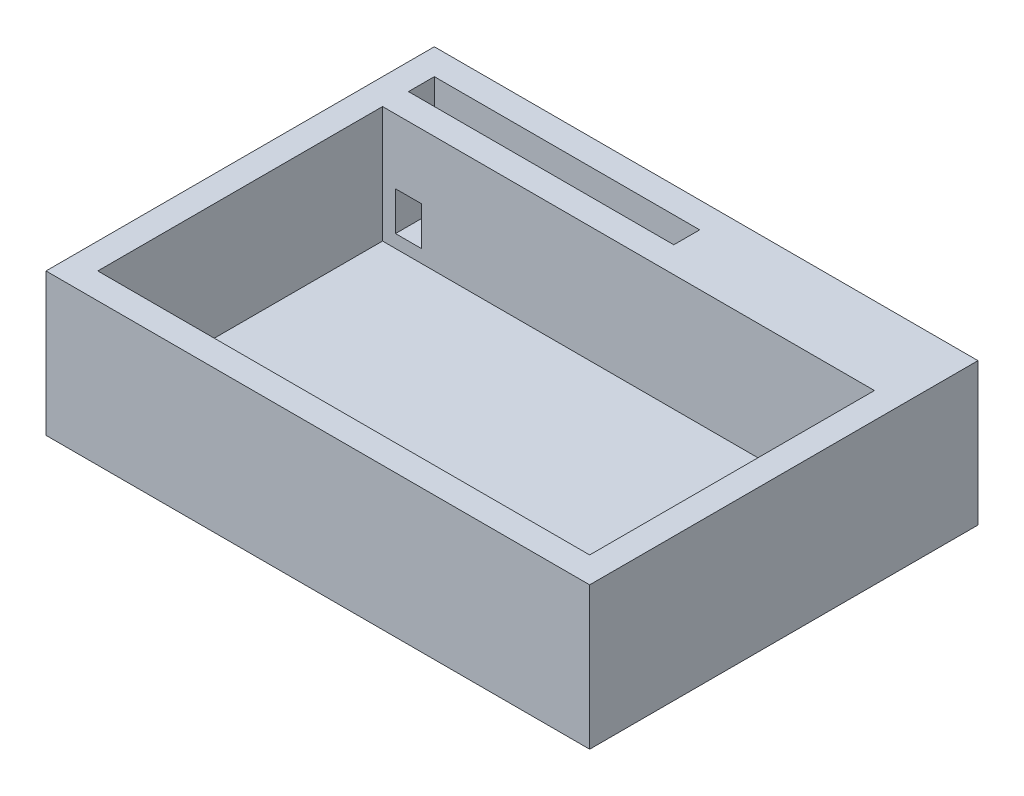
ISO-10303-21;
HEADER;
FILE_DESCRIPTION(('STEP AP214'),'2;1');
FILE_NAME('part.step','',(''),(''),'','','');
FILE_SCHEMA(('AUTOMOTIVE_DESIGN { 1 0 10303 214 1 1 1 1 }'));
ENDSEC;
DATA;
#1=APPLICATION_CONTEXT('core data for automotive mechanical design processes');
#2=APPLICATION_PROTOCOL_DEFINITION('international standard','automotive_design',2000,#1);
#3=PRODUCT_CONTEXT('',#1,'mechanical');
#4=PRODUCT('Part','Part','',(#3));
#5=PRODUCT_RELATED_PRODUCT_CATEGORY('part','',(#4));
#6=PRODUCT_DEFINITION_FORMATION('','',#4);
#7=PRODUCT_DEFINITION_CONTEXT('part definition',#1,'design');
#8=PRODUCT_DEFINITION('design','',#6,#7);
#9=PRODUCT_DEFINITION_SHAPE('','',#8);
#10=(LENGTH_UNIT() NAMED_UNIT(*) SI_UNIT(.MILLI.,.METRE.));
#11=(NAMED_UNIT(*) PLANE_ANGLE_UNIT() SI_UNIT($,.RADIAN.));
#12=(NAMED_UNIT(*) SI_UNIT($,.STERADIAN.) SOLID_ANGLE_UNIT());
#13=UNCERTAINTY_MEASURE_WITH_UNIT(LENGTH_MEASURE(1.E-05),#10,'distance_accuracy_value','');
#14=(GEOMETRIC_REPRESENTATION_CONTEXT(3) GLOBAL_UNCERTAINTY_ASSIGNED_CONTEXT((#13)) GLOBAL_UNIT_ASSIGNED_CONTEXT((#10,
#11,#12)) REPRESENTATION_CONTEXT('',''));
#15=CARTESIAN_POINT('',(0.,0.,0.));
#16=DIRECTION('',(0.,0.,1.));
#17=DIRECTION('',(1.,0.,0.));
#18=AXIS2_PLACEMENT_3D('',#15,#16,#17);
#19=CARTESIAN_POINT('',(0.,2.,0.));
#20=DIRECTION('',(1.,0.,0.));
#21=DIRECTION('',(0.,0.,-1.));
#22=AXIS2_PLACEMENT_3D('',#19,#20,#21);
#23=PLANE('',#22);
#24=DIRECTION('',(0.,0.,1.));
#25=VECTOR('',#24,1.);
#26=CARTESIAN_POINT('',(0.,0.,0.));
#27=LINE('',#26,#25);
#28=CARTESIAN_POINT('',(0.,0.,-30.));
#29=VERTEX_POINT('',#28);
#30=CARTESIAN_POINT('',(0.,0.,0.));
#31=VERTEX_POINT('',#30);
#32=EDGE_CURVE('E306',#29,#31,#27,.T.);
#33=ORIENTED_EDGE('',*,*,#32,.T.);
#34=DIRECTION('',(0.,-1.,0.));
#35=VECTOR('',#34,1.);
#36=CARTESIAN_POINT('',(0.,2.,0.));
#37=LINE('',#36,#35);
#38=CARTESIAN_POINT('',(0.,11.,0.));
#39=VERTEX_POINT('',#38);
#40=EDGE_CURVE('E11',#39,#31,#37,.T.);
#41=ORIENTED_EDGE('',*,*,#40,.F.);
#42=DIRECTION('',(0.,0.,1.));
#43=VECTOR('',#42,1.);
#44=CARTESIAN_POINT('',(0.,11.,-30.));
#45=LINE('',#44,#43);
#46=CARTESIAN_POINT('',(0.,11.,-30.));
#47=VERTEX_POINT('',#46);
#48=EDGE_CURVE('E290',#47,#39,#45,.T.);
#49=ORIENTED_EDGE('',*,*,#48,.F.);
#50=DIRECTION('',(0.,-1.,0.));
#51=VECTOR('',#50,1.);
#52=CARTESIAN_POINT('',(0.,2.,-30.));
#53=LINE('',#52,#51);
#54=EDGE_CURVE('E319',#47,#29,#53,.T.);
#55=ORIENTED_EDGE('',*,*,#54,.T.);
#56=EDGE_LOOP('',(#33,#41,#49,#55));
#57=FACE_BOUND('',#56,.T.);
#58=ADVANCED_FACE('F45',(#57),#23,.F.);
#59=CARTESIAN_POINT('',(0.,2.,0.));
#60=DIRECTION('',(0.,0.,-1.));
#61=DIRECTION('',(-1.,0.,0.));
#62=AXIS2_PLACEMENT_3D('',#59,#60,#61);
#63=PLANE('',#62);
#64=DIRECTION('',(1.,0.,0.));
#65=VECTOR('',#64,1.);
#66=CARTESIAN_POINT('',(0.,0.,0.));
#67=LINE('',#66,#65);
#68=CARTESIAN_POINT('',(42.,0.,0.));
#69=VERTEX_POINT('',#68);
#70=EDGE_CURVE('E310',#31,#69,#67,.T.);
#71=ORIENTED_EDGE('',*,*,#70,.T.);
#72=DIRECTION('',(0.,-1.,0.));
#73=VECTOR('',#72,1.);
#74=CARTESIAN_POINT('',(42.,2.,0.));
#75=LINE('',#74,#73);
#76=CARTESIAN_POINT('',(42.,11.,0.));
#77=VERTEX_POINT('',#76);
#78=EDGE_CURVE('E53',#77,#69,#75,.T.);
#79=ORIENTED_EDGE('',*,*,#78,.F.);
#80=DIRECTION('',(1.,0.,0.));
#81=VECTOR('',#80,1.);
#82=CARTESIAN_POINT('',(0.,11.,0.));
#83=LINE('',#82,#81);
#84=EDGE_CURVE('E294',#39,#77,#83,.T.);
#85=ORIENTED_EDGE('',*,*,#84,.F.);
#86=ORIENTED_EDGE('',*,*,#40,.T.);
#87=EDGE_LOOP('',(#71,#79,#85,#86));
#88=FACE_BOUND('',#87,.T.);
#89=ADVANCED_FACE('F346',(#88),#63,.F.);
#90=CARTESIAN_POINT('',(42.,2.,0.));
#91=DIRECTION('',(-1.,0.,0.));
#92=DIRECTION('',(0.,0.,1.));
#93=AXIS2_PLACEMENT_3D('',#90,#91,#92);
#94=PLANE('',#93);
#95=DIRECTION('',(0.,0.,-1.));
#96=VECTOR('',#95,1.);
#97=CARTESIAN_POINT('',(42.,0.,0.));
#98=LINE('',#97,#96);
#99=CARTESIAN_POINT('',(42.,0.,-30.));
#100=VERTEX_POINT('',#99);
#101=EDGE_CURVE('E313',#69,#100,#98,.T.);
#102=ORIENTED_EDGE('',*,*,#101,.T.);
#103=DIRECTION('',(0.,-1.,0.));
#104=VECTOR('',#103,1.);
#105=CARTESIAN_POINT('',(42.,2.,-30.));
#106=LINE('',#105,#104);
#107=CARTESIAN_POINT('',(42.,11.,-30.));
#108=VERTEX_POINT('',#107);
#109=EDGE_CURVE('E323',#108,#100,#106,.T.);
#110=ORIENTED_EDGE('',*,*,#109,.F.);
#111=DIRECTION('',(0.,0.,-1.));
#112=VECTOR('',#111,1.);
#113=CARTESIAN_POINT('',(42.,11.,-30.));
#114=LINE('',#113,#112);
#115=EDGE_CURVE('E298',#77,#108,#114,.T.);
#116=ORIENTED_EDGE('',*,*,#115,.F.);
#117=ORIENTED_EDGE('',*,*,#78,.T.);
#118=EDGE_LOOP('',(#102,#110,#116,#117));
#119=FACE_BOUND('',#118,.T.);
#120=ADVANCED_FACE('F331',(#119),#94,.F.);
#121=CARTESIAN_POINT('',(0.,2.,-30.));
#122=DIRECTION('',(0.,0.,1.));
#123=DIRECTION('',(1.,0.,0.));
#124=AXIS2_PLACEMENT_3D('',#121,#122,#123);
#125=PLANE('',#124);
#126=DIRECTION('',(-1.,0.,0.));
#127=VECTOR('',#126,1.);
#128=CARTESIAN_POINT('',(0.,0.,-30.));
#129=LINE('',#128,#127);
#130=EDGE_CURVE('E316',#100,#29,#129,.T.);
#131=ORIENTED_EDGE('',*,*,#130,.T.);
#132=ORIENTED_EDGE('',*,*,#54,.F.);
#133=DIRECTION('',(-1.,0.,0.));
#134=VECTOR('',#133,1.);
#135=CARTESIAN_POINT('',(0.,11.,-30.));
#136=LINE('',#135,#134);
#137=EDGE_CURVE('E302',#108,#47,#136,.T.);
#138=ORIENTED_EDGE('',*,*,#137,.F.);
#139=ORIENTED_EDGE('',*,*,#109,.T.);
#140=EDGE_LOOP('',(#131,#132,#138,#139));
#141=FACE_BOUND('',#140,.T.);
#142=ADVANCED_FACE('F339',(#141),#125,.F.);
#143=CARTESIAN_POINT('',(0.,0.,0.));
#144=DIRECTION('',(0.,-1.,0.));
#145=DIRECTION('',(0.,0.,-1.));
#146=AXIS2_PLACEMENT_3D('',#143,#144,#145);
#147=PLANE('',#146);
#148=ORIENTED_EDGE('',*,*,#32,.F.);
#149=ORIENTED_EDGE('',*,*,#130,.F.);
#150=ORIENTED_EDGE('',*,*,#101,.F.);
#151=ORIENTED_EDGE('',*,*,#70,.F.);
#152=EDGE_LOOP('',(#148,#149,#150,#151));
#153=FACE_BOUND('',#152,.T.);
#154=ADVANCED_FACE('F337',(#153),#147,.T.);
#155=CARTESIAN_POINT('',(0.,11.,0.));
#156=DIRECTION('',(0.,1.,0.));
#157=DIRECTION('',(0.,0.,1.));
#158=AXIS2_PLACEMENT_3D('',#155,#156,#157);
#159=PLANE('',#158);
#160=ORIENTED_EDGE('',*,*,#48,.T.);
#161=ORIENTED_EDGE('',*,*,#84,.T.);
#162=ORIENTED_EDGE('',*,*,#115,.T.);
#163=ORIENTED_EDGE('',*,*,#137,.T.);
#164=EDGE_LOOP('',(#160,#161,#162,#163));
#165=FACE_BOUND('',#164,.T.);
#166=DIRECTION('',(1.,0.,0.));
#167=VECTOR('',#166,1.);
#168=CARTESIAN_POINT('',(2.,11.,-26.));
#169=LINE('',#168,#167);
#170=CARTESIAN_POINT('',(2.,11.,-26.));
#171=VERTEX_POINT('',#170);
#172=CARTESIAN_POINT('',(22.5,11.,-26.));
#173=VERTEX_POINT('',#172);
#174=EDGE_CURVE('E252',#171,#173,#169,.T.);
#175=ORIENTED_EDGE('',*,*,#174,.F.);
#176=DIRECTION('',(0.,0.,1.));
#177=VECTOR('',#176,1.);
#178=CARTESIAN_POINT('',(2.,11.,-28.));
#179=LINE('',#178,#177);
#180=CARTESIAN_POINT('',(2.,11.,-28.));
#181=VERTEX_POINT('',#180);
#182=EDGE_CURVE('E249',#181,#171,#179,.T.);
#183=ORIENTED_EDGE('',*,*,#182,.F.);
#184=DIRECTION('',(-1.,0.,0.));
#185=VECTOR('',#184,1.);
#186=CARTESIAN_POINT('',(2.,11.,-28.));
#187=LINE('',#186,#185);
#188=CARTESIAN_POINT('',(22.5,11.,-28.));
#189=VERTEX_POINT('',#188);
#190=EDGE_CURVE('E260',#189,#181,#187,.T.);
#191=ORIENTED_EDGE('',*,*,#190,.F.);
#192=DIRECTION('',(0.,0.,-1.));
#193=VECTOR('',#192,1.);
#194=CARTESIAN_POINT('',(22.5,11.,-26.));
#195=LINE('',#194,#193);
#196=EDGE_CURVE('E256',#173,#189,#195,.T.);
#197=ORIENTED_EDGE('',*,*,#196,.F.);
#198=EDGE_LOOP('',(#175,#183,#191,#197));
#199=FACE_BOUND('',#198,.T.);
#200=DIRECTION('',(-1.,0.,0.));
#201=VECTOR('',#200,1.);
#202=CARTESIAN_POINT('',(2.,11.,-24.));
#203=LINE('',#202,#201);
#204=CARTESIAN_POINT('',(40.,11.,-24.));
#205=VERTEX_POINT('',#204);
#206=CARTESIAN_POINT('',(2.,11.,-24.));
#207=VERTEX_POINT('',#206);
#208=EDGE_CURVE('E210',#205,#207,#203,.T.);
#209=ORIENTED_EDGE('',*,*,#208,.F.);
#210=DIRECTION('',(0.,0.,-1.));
#211=VECTOR('',#210,1.);
#212=CARTESIAN_POINT('',(40.,11.,-24.));
#213=LINE('',#212,#211);
#214=CARTESIAN_POINT('',(40.,11.,-2.));
#215=VERTEX_POINT('',#214);
#216=EDGE_CURVE('E207',#215,#205,#213,.T.);
#217=ORIENTED_EDGE('',*,*,#216,.F.);
#218=DIRECTION('',(1.,0.,0.));
#219=VECTOR('',#218,1.);
#220=CARTESIAN_POINT('',(2.,11.,-2.));
#221=LINE('',#220,#219);
#222=CARTESIAN_POINT('',(2.,11.,-2.));
#223=VERTEX_POINT('',#222);
#224=EDGE_CURVE('E218',#223,#215,#221,.T.);
#225=ORIENTED_EDGE('',*,*,#224,.F.);
#226=DIRECTION('',(0.,0.,1.));
#227=VECTOR('',#226,1.);
#228=CARTESIAN_POINT('',(2.,11.,-24.));
#229=LINE('',#228,#227);
#230=EDGE_CURVE('E214',#207,#223,#229,.T.);
#231=ORIENTED_EDGE('',*,*,#230,.F.);
#232=EDGE_LOOP('',(#209,#217,#225,#231));
#233=FACE_BOUND('',#232,.T.);
#234=ADVANCED_FACE('F344',(#165,#199,#233),#159,.T.);
#235=CARTESIAN_POINT('',(2.,11.,-28.));
#236=DIRECTION('',(1.,0.,0.));
#237=DIRECTION('',(0.,0.,-1.));
#238=AXIS2_PLACEMENT_3D('',#235,#236,#237);
#239=PLANE('',#238);
#240=DIRECTION('',(0.,0.,1.));
#241=VECTOR('',#240,1.);
#242=CARTESIAN_POINT('',(2.,2.,-28.));
#243=LINE('',#242,#241);
#244=CARTESIAN_POINT('',(2.,2.,-28.));
#245=VERTEX_POINT('',#244);
#246=CARTESIAN_POINT('',(2.,2.,-26.));
#247=VERTEX_POINT('',#246);
#248=EDGE_CURVE('E248',#245,#247,#243,.T.);
#249=ORIENTED_EDGE('',*,*,#248,.F.);
#250=DIRECTION('',(0.,-1.,0.));
#251=VECTOR('',#250,1.);
#252=CARTESIAN_POINT('',(2.,11.,-28.));
#253=LINE('',#252,#251);
#254=EDGE_CURVE('E263',#181,#245,#253,.T.);
#255=ORIENTED_EDGE('',*,*,#254,.F.);
#256=ORIENTED_EDGE('',*,*,#182,.T.);
#257=DIRECTION('',(0.,-1.,0.));
#258=VECTOR('',#257,1.);
#259=CARTESIAN_POINT('',(2.,11.,-26.));
#260=LINE('',#259,#258);
#261=EDGE_CURVE('E286',#171,#247,#260,.T.);
#262=ORIENTED_EDGE('',*,*,#261,.T.);
#263=EDGE_LOOP('',(#249,#255,#256,#262));
#264=FACE_BOUND('',#263,.T.);
#265=ADVANCED_FACE('F365',(#264),#239,.T.);
#266=CARTESIAN_POINT('',(2.,11.,-26.));
#267=DIRECTION('',(0.,0.,-1.));
#268=DIRECTION('',(-1.,0.,0.));
#269=AXIS2_PLACEMENT_3D('',#266,#267,#268);
#270=PLANE('',#269);
#271=DIRECTION('',(0.,-1.,0.));
#272=VECTOR('',#271,1.);
#273=CARTESIAN_POINT('',(3.,3.,-26.));
#274=LINE('',#273,#272);
#275=CARTESIAN_POINT('',(3.,6.,-26.));
#276=VERTEX_POINT('',#275);
#277=CARTESIAN_POINT('',(3.,3.,-26.));
#278=VERTEX_POINT('',#277);
#279=EDGE_CURVE('E160',#276,#278,#274,.T.);
#280=ORIENTED_EDGE('',*,*,#279,.T.);
#281=DIRECTION('',(1.,0.,0.));
#282=VECTOR('',#281,1.);
#283=CARTESIAN_POINT('',(3.,3.,-26.));
#284=LINE('',#283,#282);
#285=CARTESIAN_POINT('',(5.,3.,-26.));
#286=VERTEX_POINT('',#285);
#287=EDGE_CURVE('E170',#278,#286,#284,.T.);
#288=ORIENTED_EDGE('',*,*,#287,.T.);
#289=DIRECTION('',(0.,1.,0.));
#290=VECTOR('',#289,1.);
#291=CARTESIAN_POINT('',(5.,3.,-26.));
#292=LINE('',#291,#290);
#293=CARTESIAN_POINT('',(5.,6.,-26.));
#294=VERTEX_POINT('',#293);
#295=EDGE_CURVE('E60',#286,#294,#292,.T.);
#296=ORIENTED_EDGE('',*,*,#295,.T.);
#297=DIRECTION('',(-1.,0.,0.));
#298=VECTOR('',#297,1.);
#299=CARTESIAN_POINT('',(3.,6.,-26.));
#300=LINE('',#299,#298);
#301=EDGE_CURVE('E167',#294,#276,#300,.T.);
#302=ORIENTED_EDGE('',*,*,#301,.T.);
#303=EDGE_LOOP('',(#280,#288,#296,#302));
#304=FACE_BOUND('',#303,.T.);
#305=DIRECTION('',(1.,0.,0.));
#306=VECTOR('',#305,1.);
#307=CARTESIAN_POINT('',(2.,2.,-26.));
#308=LINE('',#307,#306);
#309=CARTESIAN_POINT('',(22.5,2.,-26.));
#310=VERTEX_POINT('',#309);
#311=EDGE_CURVE('E267',#247,#310,#308,.T.);
#312=ORIENTED_EDGE('',*,*,#311,.F.);
#313=ORIENTED_EDGE('',*,*,#261,.F.);
#314=ORIENTED_EDGE('',*,*,#174,.T.);
#315=DIRECTION('',(0.,-1.,0.));
#316=VECTOR('',#315,1.);
#317=CARTESIAN_POINT('',(22.5,11.,-26.));
#318=LINE('',#317,#316);
#319=EDGE_CURVE('E283',#173,#310,#318,.T.);
#320=ORIENTED_EDGE('',*,*,#319,.T.);
#321=EDGE_LOOP('',(#312,#313,#314,#320));
#322=FACE_BOUND('',#321,.T.);
#323=ADVANCED_FACE('F175',(#304,#322),#270,.T.);
#324=CARTESIAN_POINT('',(22.5,11.,-26.));
#325=DIRECTION('',(-1.,0.,0.));
#326=DIRECTION('',(0.,0.,1.));
#327=AXIS2_PLACEMENT_3D('',#324,#325,#326);
#328=PLANE('',#327);
#329=DIRECTION('',(0.,0.,-1.));
#330=VECTOR('',#329,1.);
#331=CARTESIAN_POINT('',(22.5,2.,-26.));
#332=LINE('',#331,#330);
#333=CARTESIAN_POINT('',(22.5,2.,-28.));
#334=VERTEX_POINT('',#333);
#335=EDGE_CURVE('E271',#310,#334,#332,.T.);
#336=ORIENTED_EDGE('',*,*,#335,.F.);
#337=ORIENTED_EDGE('',*,*,#319,.F.);
#338=ORIENTED_EDGE('',*,*,#196,.T.);
#339=DIRECTION('',(0.,-1.,0.));
#340=VECTOR('',#339,1.);
#341=CARTESIAN_POINT('',(22.5,11.,-28.));
#342=LINE('',#341,#340);
#343=EDGE_CURVE('E280',#189,#334,#342,.T.);
#344=ORIENTED_EDGE('',*,*,#343,.T.);
#345=EDGE_LOOP('',(#336,#337,#338,#344));
#346=FACE_BOUND('',#345,.T.);
#347=ADVANCED_FACE('F371',(#346),#328,.T.);
#348=CARTESIAN_POINT('',(2.,11.,-28.));
#349=DIRECTION('',(0.,0.,1.));
#350=DIRECTION('',(1.,0.,0.));
#351=AXIS2_PLACEMENT_3D('',#348,#349,#350);
#352=PLANE('',#351);
#353=DIRECTION('',(-1.,0.,0.));
#354=VECTOR('',#353,1.);
#355=CARTESIAN_POINT('',(2.,2.,-28.));
#356=LINE('',#355,#354);
#357=EDGE_CURVE('E253',#334,#245,#356,.T.);
#358=ORIENTED_EDGE('',*,*,#357,.F.);
#359=ORIENTED_EDGE('',*,*,#343,.F.);
#360=ORIENTED_EDGE('',*,*,#190,.T.);
#361=ORIENTED_EDGE('',*,*,#254,.T.);
#362=EDGE_LOOP('',(#358,#359,#360,#361));
#363=FACE_BOUND('',#362,.T.);
#364=ADVANCED_FACE('F374',(#363),#352,.T.);
#365=CARTESIAN_POINT('',(40.,11.,-24.));
#366=DIRECTION('',(-1.,0.,0.));
#367=DIRECTION('',(0.,0.,1.));
#368=AXIS2_PLACEMENT_3D('',#365,#366,#367);
#369=PLANE('',#368);
#370=DIRECTION('',(0.,0.,-1.));
#371=VECTOR('',#370,1.);
#372=CARTESIAN_POINT('',(40.,2.,-24.));
#373=LINE('',#372,#371);
#374=CARTESIAN_POINT('',(40.,2.,-2.));
#375=VERTEX_POINT('',#374);
#376=CARTESIAN_POINT('',(40.,2.,-24.));
#377=VERTEX_POINT('',#376);
#378=EDGE_CURVE('E201',#375,#377,#373,.T.);
#379=ORIENTED_EDGE('',*,*,#378,.F.);
#380=DIRECTION('',(0.,-1.,0.));
#381=VECTOR('',#380,1.);
#382=CARTESIAN_POINT('',(40.,11.,-2.));
#383=LINE('',#382,#381);
#384=EDGE_CURVE('E221',#215,#375,#383,.T.);
#385=ORIENTED_EDGE('',*,*,#384,.F.);
#386=ORIENTED_EDGE('',*,*,#216,.T.);
#387=DIRECTION('',(0.,-1.,0.));
#388=VECTOR('',#387,1.);
#389=CARTESIAN_POINT('',(40.,11.,-24.));
#390=LINE('',#389,#388);
#391=EDGE_CURVE('E244',#205,#377,#390,.T.);
#392=ORIENTED_EDGE('',*,*,#391,.T.);
#393=EDGE_LOOP('',(#379,#385,#386,#392));
#394=FACE_BOUND('',#393,.T.);
#395=ADVANCED_FACE('F378',(#394),#369,.T.);
#396=CARTESIAN_POINT('',(2.,11.,-24.));
#397=DIRECTION('',(0.,0.,1.));
#398=DIRECTION('',(1.,0.,0.));
#399=AXIS2_PLACEMENT_3D('',#396,#397,#398);
#400=PLANE('',#399);
#401=DIRECTION('',(0.,-1.,0.));
#402=VECTOR('',#401,1.);
#403=CARTESIAN_POINT('',(3.,3.,-24.));
#404=LINE('',#403,#402);
#405=CARTESIAN_POINT('',(3.,6.,-24.));
#406=VERTEX_POINT('',#405);
#407=CARTESIAN_POINT('',(3.,3.,-24.));
#408=VERTEX_POINT('',#407);
#409=EDGE_CURVE('E68',#406,#408,#404,.T.);
#410=ORIENTED_EDGE('',*,*,#409,.F.);
#411=DIRECTION('',(-1.,0.,0.));
#412=VECTOR('',#411,1.);
#413=CARTESIAN_POINT('',(3.,6.,-24.));
#414=LINE('',#413,#412);
#415=CARTESIAN_POINT('',(5.,6.,-24.));
#416=VERTEX_POINT('',#415);
#417=EDGE_CURVE('E179',#416,#406,#414,.T.);
#418=ORIENTED_EDGE('',*,*,#417,.F.);
#419=DIRECTION('',(0.,1.,0.));
#420=VECTOR('',#419,1.);
#421=CARTESIAN_POINT('',(5.,3.,-24.));
#422=LINE('',#421,#420);
#423=CARTESIAN_POINT('',(5.,3.,-24.));
#424=VERTEX_POINT('',#423);
#425=EDGE_CURVE('E183',#424,#416,#422,.T.);
#426=ORIENTED_EDGE('',*,*,#425,.F.);
#427=DIRECTION('',(1.,0.,0.));
#428=VECTOR('',#427,1.);
#429=CARTESIAN_POINT('',(3.,3.,-24.));
#430=LINE('',#429,#428);
#431=EDGE_CURVE('E192',#408,#424,#430,.T.);
#432=ORIENTED_EDGE('',*,*,#431,.F.);
#433=EDGE_LOOP('',(#410,#418,#426,#432));
#434=FACE_BOUND('',#433,.T.);
#435=DIRECTION('',(-1.,0.,0.));
#436=VECTOR('',#435,1.);
#437=CARTESIAN_POINT('',(2.,2.,-24.));
#438=LINE('',#437,#436);
#439=CARTESIAN_POINT('',(2.,2.,-24.));
#440=VERTEX_POINT('',#439);
#441=EDGE_CURVE('E225',#377,#440,#438,.T.);
#442=ORIENTED_EDGE('',*,*,#441,.F.);
#443=ORIENTED_EDGE('',*,*,#391,.F.);
#444=ORIENTED_EDGE('',*,*,#208,.T.);
#445=DIRECTION('',(0.,-1.,0.));
#446=VECTOR('',#445,1.);
#447=CARTESIAN_POINT('',(2.,11.,-24.));
#448=LINE('',#447,#446);
#449=EDGE_CURVE('E241',#207,#440,#448,.T.);
#450=ORIENTED_EDGE('',*,*,#449,.T.);
#451=EDGE_LOOP('',(#442,#443,#444,#450));
#452=FACE_BOUND('',#451,.T.);
#453=ADVANCED_FACE('F382',(#434,#452),#400,.T.);
#454=CARTESIAN_POINT('',(2.,11.,-24.));
#455=DIRECTION('',(1.,0.,0.));
#456=DIRECTION('',(0.,0.,-1.));
#457=AXIS2_PLACEMENT_3D('',#454,#455,#456);
#458=PLANE('',#457);
#459=DIRECTION('',(0.,0.,1.));
#460=VECTOR('',#459,1.);
#461=CARTESIAN_POINT('',(2.,2.,-24.));
#462=LINE('',#461,#460);
#463=CARTESIAN_POINT('',(2.,2.,-2.));
#464=VERTEX_POINT('',#463);
#465=EDGE_CURVE('E229',#440,#464,#462,.T.);
#466=ORIENTED_EDGE('',*,*,#465,.F.);
#467=ORIENTED_EDGE('',*,*,#449,.F.);
#468=ORIENTED_EDGE('',*,*,#230,.T.);
#469=DIRECTION('',(0.,-1.,0.));
#470=VECTOR('',#469,1.);
#471=CARTESIAN_POINT('',(2.,11.,-2.));
#472=LINE('',#471,#470);
#473=EDGE_CURVE('E238',#223,#464,#472,.T.);
#474=ORIENTED_EDGE('',*,*,#473,.T.);
#475=EDGE_LOOP('',(#466,#467,#468,#474));
#476=FACE_BOUND('',#475,.T.);
#477=ADVANCED_FACE('F386',(#476),#458,.T.);
#478=CARTESIAN_POINT('',(2.,11.,-2.));
#479=DIRECTION('',(0.,0.,-1.));
#480=DIRECTION('',(-1.,0.,0.));
#481=AXIS2_PLACEMENT_3D('',#478,#479,#480);
#482=PLANE('',#481);
#483=DIRECTION('',(1.,0.,0.));
#484=VECTOR('',#483,1.);
#485=CARTESIAN_POINT('',(2.,2.,-2.));
#486=LINE('',#485,#484);
#487=EDGE_CURVE('E211',#464,#375,#486,.T.);
#488=ORIENTED_EDGE('',*,*,#487,.F.);
#489=ORIENTED_EDGE('',*,*,#473,.F.);
#490=ORIENTED_EDGE('',*,*,#224,.T.);
#491=ORIENTED_EDGE('',*,*,#384,.T.);
#492=EDGE_LOOP('',(#488,#489,#490,#491));
#493=FACE_BOUND('',#492,.T.);
#494=ADVANCED_FACE('F390',(#493),#482,.T.);
#495=CARTESIAN_POINT('',(0.,2.,0.));
#496=DIRECTION('',(0.,-1.,0.));
#497=DIRECTION('',(0.,0.,-1.));
#498=AXIS2_PLACEMENT_3D('',#495,#496,#497);
#499=PLANE('',#498);
#500=ORIENTED_EDGE('',*,*,#357,.T.);
#501=ORIENTED_EDGE('',*,*,#248,.T.);
#502=ORIENTED_EDGE('',*,*,#311,.T.);
#503=ORIENTED_EDGE('',*,*,#335,.T.);
#504=EDGE_LOOP('',(#500,#501,#502,#503));
#505=FACE_BOUND('',#504,.T.);
#506=ADVANCED_FACE('F361',(#505),#499,.F.);
#507=ORIENTED_EDGE('',*,*,#487,.T.);
#508=ORIENTED_EDGE('',*,*,#378,.T.);
#509=ORIENTED_EDGE('',*,*,#441,.T.);
#510=ORIENTED_EDGE('',*,*,#465,.T.);
#511=EDGE_LOOP('',(#507,#508,#509,#510));
#512=FACE_BOUND('',#511,.T.);
#513=ADVANCED_FACE('F358',(#512),#499,.F.);
#514=CARTESIAN_POINT('',(3.,3.,-26.));
#515=DIRECTION('',(-1.,0.,0.));
#516=DIRECTION('',(0.,0.,1.));
#517=AXIS2_PLACEMENT_3D('',#514,#515,#516);
#518=PLANE('',#517);
#519=ORIENTED_EDGE('',*,*,#409,.T.);
#520=DIRECTION('',(0.,0.,1.));
#521=VECTOR('',#520,1.);
#522=CARTESIAN_POINT('',(3.,3.,-26.));
#523=LINE('',#522,#521);
#524=EDGE_CURVE('E156',#278,#408,#523,.T.);
#525=ORIENTED_EDGE('',*,*,#524,.F.);
#526=ORIENTED_EDGE('',*,*,#279,.F.);
#527=DIRECTION('',(0.,0.,1.));
#528=VECTOR('',#527,1.);
#529=CARTESIAN_POINT('',(3.,6.,-26.));
#530=LINE('',#529,#528);
#531=EDGE_CURVE('E198',#276,#406,#530,.T.);
#532=ORIENTED_EDGE('',*,*,#531,.T.);
#533=EDGE_LOOP('',(#519,#525,#526,#532));
#534=FACE_BOUND('',#533,.T.);
#535=ADVANCED_FACE('F158',(#534),#518,.F.);
#536=CARTESIAN_POINT('',(3.,6.,-26.));
#537=DIRECTION('',(0.,1.,0.));
#538=DIRECTION('',(0.,0.,1.));
#539=AXIS2_PLACEMENT_3D('',#536,#537,#538);
#540=PLANE('',#539);
#541=ORIENTED_EDGE('',*,*,#417,.T.);
#542=ORIENTED_EDGE('',*,*,#531,.F.);
#543=ORIENTED_EDGE('',*,*,#301,.F.);
#544=DIRECTION('',(0.,0.,1.));
#545=VECTOR('',#544,1.);
#546=CARTESIAN_POINT('',(5.,6.,-26.));
#547=LINE('',#546,#545);
#548=EDGE_CURVE('E202',#294,#416,#547,.T.);
#549=ORIENTED_EDGE('',*,*,#548,.T.);
#550=EDGE_LOOP('',(#541,#542,#543,#549));
#551=FACE_BOUND('',#550,.T.);
#552=ADVANCED_FACE('F397',(#551),#540,.F.);
#553=CARTESIAN_POINT('',(5.,3.,-26.));
#554=DIRECTION('',(1.,0.,0.));
#555=DIRECTION('',(0.,0.,-1.));
#556=AXIS2_PLACEMENT_3D('',#553,#554,#555);
#557=PLANE('',#556);
#558=ORIENTED_EDGE('',*,*,#425,.T.);
#559=ORIENTED_EDGE('',*,*,#548,.F.);
#560=ORIENTED_EDGE('',*,*,#295,.F.);
#561=DIRECTION('',(0.,0.,1.));
#562=VECTOR('',#561,1.);
#563=CARTESIAN_POINT('',(5.,3.,-26.));
#564=LINE('',#563,#562);
#565=EDGE_CURVE('E166',#286,#424,#564,.T.);
#566=ORIENTED_EDGE('',*,*,#565,.T.);
#567=EDGE_LOOP('',(#558,#559,#560,#566));
#568=FACE_BOUND('',#567,.T.);
#569=ADVANCED_FACE('F400',(#568),#557,.F.);
#570=CARTESIAN_POINT('',(3.,3.,-26.));
#571=DIRECTION('',(0.,-1.,0.));
#572=DIRECTION('',(0.,0.,-1.));
#573=AXIS2_PLACEMENT_3D('',#570,#571,#572);
#574=PLANE('',#573);
#575=ORIENTED_EDGE('',*,*,#431,.T.);
#576=ORIENTED_EDGE('',*,*,#565,.F.);
#577=ORIENTED_EDGE('',*,*,#287,.F.);
#578=ORIENTED_EDGE('',*,*,#524,.T.);
#579=EDGE_LOOP('',(#575,#576,#577,#578));
#580=FACE_BOUND('',#579,.T.);
#581=ADVANCED_FACE('F171',(#580),#574,.F.);
#582=CLOSED_SHELL('',(#58,#89,#120,#142,#154,#234,#265,#323,#347,#364,#395,#453,#477,#494,#506,
#513,#535,#552,#569,#581));
#583=MANIFOLD_SOLID_BREP('B2',#582);
#584=ADVANCED_BREP_SHAPE_REPRESENTATION('',(#18,#583),#14);
#585=SHAPE_DEFINITION_REPRESENTATION(#9,#584);
ENDSEC;
END-ISO-10303-21;
